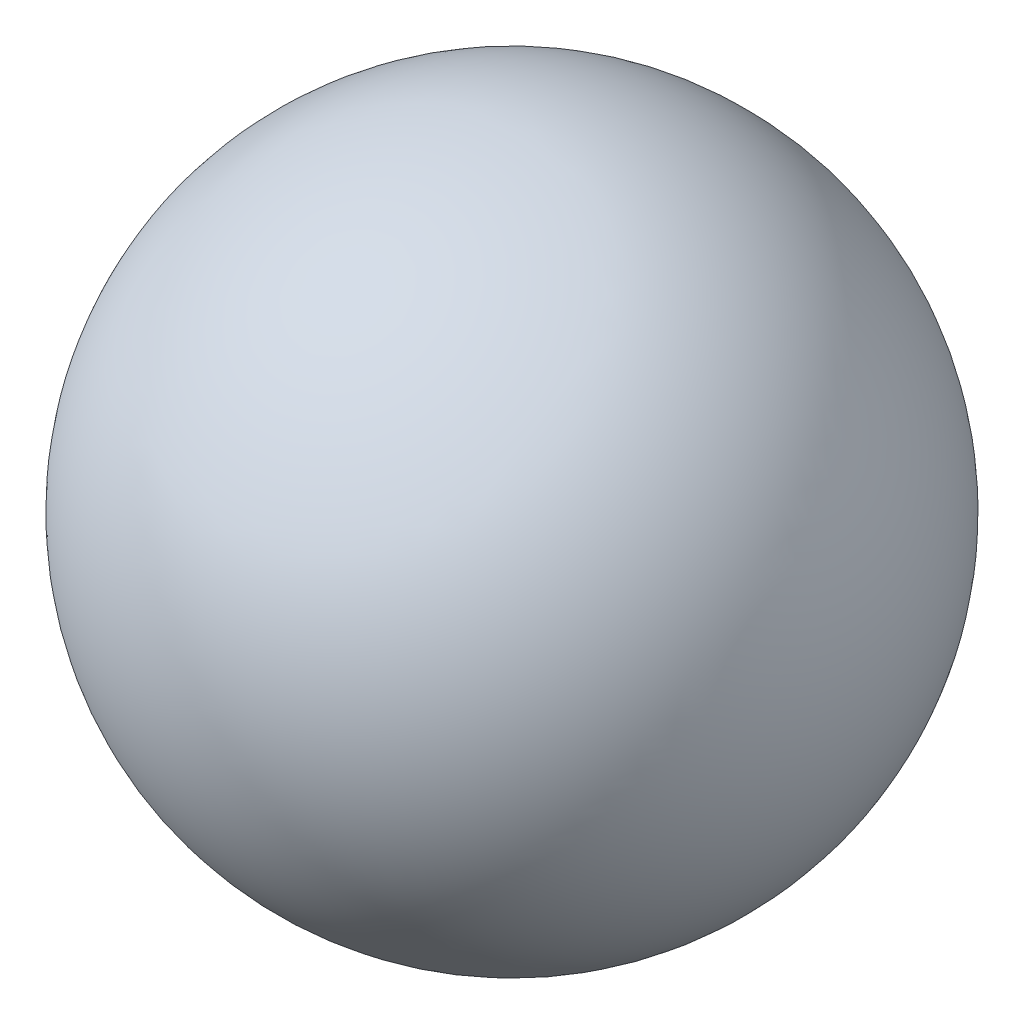
ISO-10303-21;
HEADER;
FILE_DESCRIPTION(('STEP AP214'),'2;1');
FILE_NAME('part.step','',(''),(''),'','','');
FILE_SCHEMA(('AUTOMOTIVE_DESIGN { 1 0 10303 214 1 1 1 1 }'));
ENDSEC;
DATA;
#1=APPLICATION_CONTEXT('core data for automotive mechanical design processes');
#2=APPLICATION_PROTOCOL_DEFINITION('international standard','automotive_design',2000,#1);
#3=PRODUCT_CONTEXT('',#1,'mechanical');
#4=PRODUCT('Part','Part','',(#3));
#5=PRODUCT_RELATED_PRODUCT_CATEGORY('part','',(#4));
#6=PRODUCT_DEFINITION_FORMATION('','',#4);
#7=PRODUCT_DEFINITION_CONTEXT('part definition',#1,'design');
#8=PRODUCT_DEFINITION('design','',#6,#7);
#9=PRODUCT_DEFINITION_SHAPE('','',#8);
#10=(LENGTH_UNIT() NAMED_UNIT(*) SI_UNIT(.MILLI.,.METRE.));
#11=(NAMED_UNIT(*) PLANE_ANGLE_UNIT() SI_UNIT($,.RADIAN.));
#12=(NAMED_UNIT(*) SI_UNIT($,.STERADIAN.) SOLID_ANGLE_UNIT());
#13=UNCERTAINTY_MEASURE_WITH_UNIT(LENGTH_MEASURE(1.E-05),#10,'distance_accuracy_value','');
#14=(GEOMETRIC_REPRESENTATION_CONTEXT(3) GLOBAL_UNCERTAINTY_ASSIGNED_CONTEXT((#13)) GLOBAL_UNIT_ASSIGNED_CONTEXT((#10,
#11,#12)) REPRESENTATION_CONTEXT('',''));
#15=CARTESIAN_POINT('',(0.,0.,0.));
#16=DIRECTION('',(0.,0.,1.));
#17=DIRECTION('',(1.,0.,0.));
#18=AXIS2_PLACEMENT_3D('',#15,#16,#17);
#19=CARTESIAN_POINT('',(0.,0.,0.));
#20=DIRECTION('',(-1.,0.,0.));
#21=DIRECTION('',(0.,1.,0.));
#22=AXIS2_PLACEMENT_3D('',#19,#20,#21);
#23=SPHERICAL_SURFACE('',#22,8.);
#24=CARTESIAN_POINT('',(-8.,0.,0.));
#25=VERTEX_POINT('',#24);
#26=VERTEX_LOOP('',#25);
#27=FACE_BOUND('',#26,.T.);
#28=ADVANCED_FACE('F39',(#27),#23,.T.);
#29=CLOSED_SHELL('',(#28));
#30=MANIFOLD_SOLID_BREP('B2',#29);
#31=ADVANCED_BREP_SHAPE_REPRESENTATION('',(#18,#30),#14);
#32=SHAPE_DEFINITION_REPRESENTATION(#9,#31);
ENDSEC;
END-ISO-10303-21;
